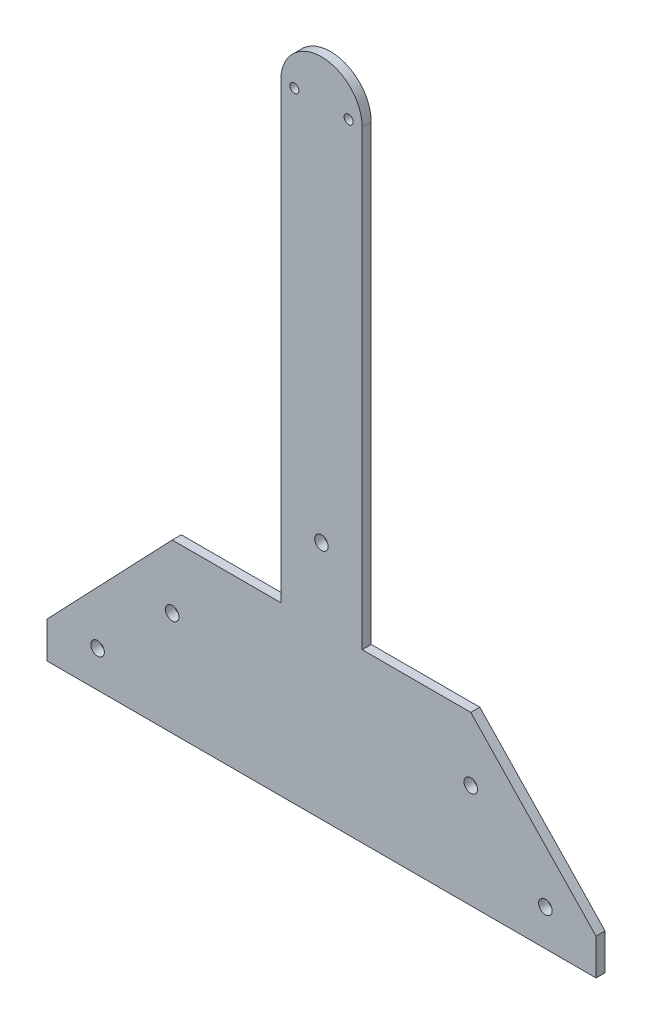
ISO-10303-21;
HEADER;
FILE_DESCRIPTION(('STEP AP214'),'2;1');
FILE_NAME('part.step','',(''),(''),'','','');
FILE_SCHEMA(('AUTOMOTIVE_DESIGN { 1 0 10303 214 1 1 1 1 }'));
ENDSEC;
DATA;
#1=APPLICATION_CONTEXT('core data for automotive mechanical design processes');
#2=APPLICATION_PROTOCOL_DEFINITION('international standard','automotive_design',2000,#1);
#3=PRODUCT_CONTEXT('',#1,'mechanical');
#4=PRODUCT('Part','Part','',(#3));
#5=PRODUCT_RELATED_PRODUCT_CATEGORY('part','',(#4));
#6=PRODUCT_DEFINITION_FORMATION('','',#4);
#7=PRODUCT_DEFINITION_CONTEXT('part definition',#1,'design');
#8=PRODUCT_DEFINITION('design','',#6,#7);
#9=PRODUCT_DEFINITION_SHAPE('','',#8);
#10=(LENGTH_UNIT() NAMED_UNIT(*) SI_UNIT(.MILLI.,.METRE.));
#11=(NAMED_UNIT(*) PLANE_ANGLE_UNIT() SI_UNIT($,.RADIAN.));
#12=(NAMED_UNIT(*) SI_UNIT($,.STERADIAN.) SOLID_ANGLE_UNIT());
#13=UNCERTAINTY_MEASURE_WITH_UNIT(LENGTH_MEASURE(1.E-05),#10,'distance_accuracy_value','');
#14=(GEOMETRIC_REPRESENTATION_CONTEXT(3) GLOBAL_UNCERTAINTY_ASSIGNED_CONTEXT((#13)) GLOBAL_UNIT_ASSIGNED_CONTEXT((#10,
#11,#12)) REPRESENTATION_CONTEXT('',''));
#15=CARTESIAN_POINT('',(0.,0.,0.));
#16=DIRECTION('',(0.,0.,1.));
#17=DIRECTION('',(1.,0.,0.));
#18=AXIS2_PLACEMENT_3D('',#15,#16,#17);
#19=CARTESIAN_POINT('',(-0.291428571428588,121.645714285714,2.));
#20=DIRECTION('',(0.,0.,-1.));
#21=DIRECTION('',(-1.,0.,0.));
#22=AXIS2_PLACEMENT_3D('',#19,#20,#21);
#23=CYLINDRICAL_SURFACE('',#22,9.);
#24=CARTESIAN_POINT('',(-0.291428571428588,121.645714285714,0.));
#25=DIRECTION('',(0.,0.,1.));
#26=DIRECTION('',(1.,0.,0.));
#27=AXIS2_PLACEMENT_3D('',#24,#25,#26);
#28=CIRCLE('',#27,9.);
#29=CARTESIAN_POINT('',(-9.29142857142859,121.645714285714,0.));
#30=VERTEX_POINT('',#29);
#31=CARTESIAN_POINT('',(8.70857142857141,121.645714285714,0.));
#32=VERTEX_POINT('',#31);
#33=EDGE_CURVE('E181',#30,#32,#28,.F.);
#34=ORIENTED_EDGE('',*,*,#33,.F.);
#35=DIRECTION('',(0.,0.,-1.));
#36=VECTOR('',#35,1.);
#37=CARTESIAN_POINT('',(-9.29142857142859,121.645714285714,2.));
#38=LINE('',#37,#36);
#39=CARTESIAN_POINT('',(-9.29142857142859,121.645714285714,2.));
#40=VERTEX_POINT('',#39);
#41=EDGE_CURVE('E11',#40,#30,#38,.T.);
#42=ORIENTED_EDGE('',*,*,#41,.F.);
#43=CARTESIAN_POINT('',(-0.291428571428588,121.645714285714,2.));
#44=DIRECTION('',(0.,0.,1.));
#45=DIRECTION('',(1.,0.,0.));
#46=AXIS2_PLACEMENT_3D('',#43,#44,#45);
#47=CIRCLE('',#46,9.);
#48=CARTESIAN_POINT('',(8.70857142857141,121.645714285714,2.));
#49=VERTEX_POINT('',#48);
#50=EDGE_CURVE('E343',#40,#49,#47,.F.);
#51=ORIENTED_EDGE('',*,*,#50,.T.);
#52=DIRECTION('',(0.,0.,-1.));
#53=VECTOR('',#52,1.);
#54=CARTESIAN_POINT('',(8.70857142857141,121.645714285714,2.));
#55=LINE('',#54,#53);
#56=EDGE_CURVE('E59',#49,#32,#55,.T.);
#57=ORIENTED_EDGE('',*,*,#56,.T.);
#58=EDGE_LOOP('',(#34,#42,#51,#57));
#59=FACE_BOUND('',#58,.T.);
#60=ADVANCED_FACE('F41',(#59),#23,.T.);
#61=CARTESIAN_POINT('',(-9.29142857142857,0.,2.));
#62=DIRECTION('',(1.,0.,0.));
#63=DIRECTION('',(0.,1.,0.));
#64=AXIS2_PLACEMENT_3D('',#61,#62,#63);
#65=PLANE('',#64);
#66=DIRECTION('',(0.,-1.,0.));
#67=VECTOR('',#66,1.);
#68=CARTESIAN_POINT('',(-9.29142857142857,0.,0.));
#69=LINE('',#68,#67);
#70=CARTESIAN_POINT('',(-9.29142857142857,21.6457142857143,0.));
#71=VERTEX_POINT('',#70);
#72=EDGE_CURVE('E184',#30,#71,#69,.T.);
#73=ORIENTED_EDGE('',*,*,#72,.T.);
#74=DIRECTION('',(0.,0.,-1.));
#75=VECTOR('',#74,1.);
#76=CARTESIAN_POINT('',(-9.29142857142857,21.6457142857143,2.));
#77=LINE('',#76,#75);
#78=CARTESIAN_POINT('',(-9.29142857142857,21.6457142857143,2.));
#79=VERTEX_POINT('',#78);
#80=EDGE_CURVE('E51',#79,#71,#77,.T.);
#81=ORIENTED_EDGE('',*,*,#80,.F.);
#82=DIRECTION('',(0.,-1.,0.));
#83=VECTOR('',#82,1.);
#84=CARTESIAN_POINT('',(-9.29142857142857,0.,2.));
#85=LINE('',#84,#83);
#86=EDGE_CURVE('E346',#40,#79,#85,.T.);
#87=ORIENTED_EDGE('',*,*,#86,.F.);
#88=ORIENTED_EDGE('',*,*,#41,.T.);
#89=EDGE_LOOP('',(#73,#81,#87,#88));
#90=FACE_BOUND('',#89,.T.);
#91=ADVANCED_FACE('F273',(#90),#65,.F.);
#92=CARTESIAN_POINT('',(0.,21.6457142857143,2.));
#93=DIRECTION('',(0.,-1.,0.));
#94=DIRECTION('',(0.,0.,-1.));
#95=AXIS2_PLACEMENT_3D('',#92,#93,#94);
#96=PLANE('',#95);
#97=DIRECTION('',(-1.,0.,0.));
#98=VECTOR('',#97,1.);
#99=CARTESIAN_POINT('',(0.,21.6457142857143,0.));
#100=LINE('',#99,#98);
#101=CARTESIAN_POINT('',(-33.2914285714285,21.6457142857143,0.));
#102=VERTEX_POINT('',#101);
#103=EDGE_CURVE('E188',#71,#102,#100,.T.);
#104=ORIENTED_EDGE('',*,*,#103,.T.);
#105=DIRECTION('',(0.,0.,-1.));
#106=VECTOR('',#105,1.);
#107=CARTESIAN_POINT('',(-33.2914285714285,21.6457142857143,2.));
#108=LINE('',#107,#106);
#109=CARTESIAN_POINT('',(-33.2914285714285,21.6457142857143,2.));
#110=VERTEX_POINT('',#109);
#111=EDGE_CURVE('E259',#110,#102,#108,.T.);
#112=ORIENTED_EDGE('',*,*,#111,.F.);
#113=DIRECTION('',(-1.,0.,0.));
#114=VECTOR('',#113,1.);
#115=CARTESIAN_POINT('',(0.,21.6457142857143,2.));
#116=LINE('',#115,#114);
#117=EDGE_CURVE('E269',#79,#110,#116,.T.);
#118=ORIENTED_EDGE('',*,*,#117,.F.);
#119=ORIENTED_EDGE('',*,*,#80,.T.);
#120=EDGE_LOOP('',(#104,#112,#118,#119));
#121=FACE_BOUND('',#120,.T.);
#122=ADVANCED_FACE('F266',(#121),#96,.F.);
#123=CARTESIAN_POINT('',(-28.222971342814,26.9529891897488,2.));
#124=DIRECTION('',(0.723190679855601,-0.690648420377542,0.));
#125=DIRECTION('',(0.690648420377542,0.723190679855601,0.));
#126=AXIS2_PLACEMENT_3D('',#123,#124,#125);
#127=PLANE('',#126);
#128=DIRECTION('',(-0.690648420377542,-0.723190679855601,0.));
#129=VECTOR('',#128,1.);
#130=CARTESIAN_POINT('',(-28.222971342814,26.9529891897488,0.));
#131=LINE('',#130,#129);
#132=CARTESIAN_POINT('',(-60.9864815482558,-7.35428571428549,0.));
#133=VERTEX_POINT('',#132);
#134=EDGE_CURVE('E192',#102,#133,#131,.T.);
#135=ORIENTED_EDGE('',*,*,#134,.T.);
#136=DIRECTION('',(0.,0.,-1.));
#137=VECTOR('',#136,1.);
#138=CARTESIAN_POINT('',(-60.9864815482558,-7.35428571428549,2.));
#139=LINE('',#138,#137);
#140=CARTESIAN_POINT('',(-60.9864815482558,-7.35428571428549,2.));
#141=VERTEX_POINT('',#140);
#142=EDGE_CURVE('E255',#141,#133,#139,.T.);
#143=ORIENTED_EDGE('',*,*,#142,.F.);
#144=DIRECTION('',(-0.690648420377542,-0.723190679855601,0.));
#145=VECTOR('',#144,1.);
#146=CARTESIAN_POINT('',(-28.222971342814,26.9529891897488,2.));
#147=LINE('',#146,#145);
#148=EDGE_CURVE('E353',#110,#141,#147,.T.);
#149=ORIENTED_EDGE('',*,*,#148,.F.);
#150=ORIENTED_EDGE('',*,*,#111,.T.);
#151=EDGE_LOOP('',(#135,#143,#149,#150));
#152=FACE_BOUND('',#151,.T.);
#153=ADVANCED_FACE('F285',(#152),#127,.F.);
#154=CARTESIAN_POINT('',(-60.9864815482558,0.,2.));
#155=DIRECTION('',(1.,0.,0.));
#156=DIRECTION('',(0.,0.,-1.));
#157=AXIS2_PLACEMENT_3D('',#154,#155,#156);
#158=PLANE('',#157);
#159=DIRECTION('',(0.,-1.,0.));
#160=VECTOR('',#159,1.);
#161=CARTESIAN_POINT('',(-60.9864815482558,0.,0.));
#162=LINE('',#161,#160);
#163=CARTESIAN_POINT('',(-60.9864815482558,-15.3542857142855,0.));
#164=VERTEX_POINT('',#163);
#165=EDGE_CURVE('E196',#133,#164,#162,.T.);
#166=ORIENTED_EDGE('',*,*,#165,.T.);
#167=DIRECTION('',(0.,0.,-1.));
#168=VECTOR('',#167,1.);
#169=CARTESIAN_POINT('',(-60.9864815482558,-15.3542857142855,2.));
#170=LINE('',#169,#168);
#171=CARTESIAN_POINT('',(-60.9864815482558,-15.3542857142855,2.));
#172=VERTEX_POINT('',#171);
#173=EDGE_CURVE('E251',#172,#164,#170,.T.);
#174=ORIENTED_EDGE('',*,*,#173,.F.);
#175=DIRECTION('',(0.,-1.,0.));
#176=VECTOR('',#175,1.);
#177=CARTESIAN_POINT('',(-60.9864815482558,0.,2.));
#178=LINE('',#177,#176);
#179=EDGE_CURVE('E357',#141,#172,#178,.T.);
#180=ORIENTED_EDGE('',*,*,#179,.F.);
#181=ORIENTED_EDGE('',*,*,#142,.T.);
#182=EDGE_LOOP('',(#166,#174,#180,#181));
#183=FACE_BOUND('',#182,.T.);
#184=ADVANCED_FACE('F288',(#183),#158,.F.);
#185=CARTESIAN_POINT('',(0.,-15.3542857142855,2.));
#186=DIRECTION('',(0.,1.,0.));
#187=DIRECTION('',(0.,0.,1.));
#188=AXIS2_PLACEMENT_3D('',#185,#186,#187);
#189=PLANE('',#188);
#190=DIRECTION('',(1.,0.,0.));
#191=VECTOR('',#190,1.);
#192=CARTESIAN_POINT('',(0.,-15.3542857142855,0.));
#193=LINE('',#192,#191);
#194=CARTESIAN_POINT('',(60.4036244053986,-15.3542857142855,0.));
#195=VERTEX_POINT('',#194);
#196=EDGE_CURVE('E200',#164,#195,#193,.T.);
#197=ORIENTED_EDGE('',*,*,#196,.T.);
#198=DIRECTION('',(0.,0.,-1.));
#199=VECTOR('',#198,1.);
#200=CARTESIAN_POINT('',(60.4036244053986,-15.3542857142855,2.));
#201=LINE('',#200,#199);
#202=CARTESIAN_POINT('',(60.4036244053986,-15.3542857142855,2.));
#203=VERTEX_POINT('',#202);
#204=EDGE_CURVE('E248',#203,#195,#201,.T.);
#205=ORIENTED_EDGE('',*,*,#204,.F.);
#206=DIRECTION('',(1.,0.,0.));
#207=VECTOR('',#206,1.);
#208=CARTESIAN_POINT('',(0.,-15.3542857142855,2.));
#209=LINE('',#208,#207);
#210=EDGE_CURVE('E361',#172,#203,#209,.T.);
#211=ORIENTED_EDGE('',*,*,#210,.F.);
#212=ORIENTED_EDGE('',*,*,#173,.T.);
#213=EDGE_LOOP('',(#197,#205,#211,#212));
#214=FACE_BOUND('',#213,.T.);
#215=ADVANCED_FACE('F292',(#214),#189,.F.);
#216=CARTESIAN_POINT('',(60.4036244053986,0.,2.));
#217=DIRECTION('',(1.,0.,0.));
#218=DIRECTION('',(0.,0.,-1.));
#219=AXIS2_PLACEMENT_3D('',#216,#217,#218);
#220=PLANE('',#219);
#221=DIRECTION('',(0.,-1.,0.));
#222=VECTOR('',#221,1.);
#223=CARTESIAN_POINT('',(60.4036244053986,0.,0.));
#224=LINE('',#223,#222);
#225=CARTESIAN_POINT('',(60.4036244053986,-7.35428571428548,0.));
#226=VERTEX_POINT('',#225);
#227=EDGE_CURVE('E204',#226,#195,#224,.T.);
#228=ORIENTED_EDGE('',*,*,#227,.F.);
#229=DIRECTION('',(0.,0.,-1.));
#230=VECTOR('',#229,1.);
#231=CARTESIAN_POINT('',(60.4036244053986,-7.35428571428548,2.));
#232=LINE('',#231,#230);
#233=CARTESIAN_POINT('',(60.4036244053986,-7.35428571428548,2.));
#234=VERTEX_POINT('',#233);
#235=EDGE_CURVE('E131',#234,#226,#232,.T.);
#236=ORIENTED_EDGE('',*,*,#235,.F.);
#237=DIRECTION('',(0.,-1.,0.));
#238=VECTOR('',#237,1.);
#239=CARTESIAN_POINT('',(60.4036244053986,0.,2.));
#240=LINE('',#239,#238);
#241=EDGE_CURVE('E142',#234,#203,#240,.T.);
#242=ORIENTED_EDGE('',*,*,#241,.T.);
#243=ORIENTED_EDGE('',*,*,#204,.T.);
#244=EDGE_LOOP('',(#228,#236,#242,#243));
#245=FACE_BOUND('',#244,.T.);
#246=ADVANCED_FACE('F296',(#245),#220,.T.);
#247=CARTESIAN_POINT('',(27.9181342830319,26.6618692407845,2.));
#248=DIRECTION('',(0.723190679855601,0.690648420377542,0.));
#249=DIRECTION('',(-0.690648420377542,0.723190679855601,0.));
#250=AXIS2_PLACEMENT_3D('',#247,#248,#249);
#251=PLANE('',#250);
#252=DIRECTION('',(0.690648420377542,-0.723190679855601,0.));
#253=VECTOR('',#252,1.);
#254=CARTESIAN_POINT('',(27.9181342830319,26.6618692407845,0.));
#255=LINE('',#254,#253);
#256=CARTESIAN_POINT('',(32.7085714285713,21.6457142857143,0.));
#257=VERTEX_POINT('',#256);
#258=EDGE_CURVE('E126',#257,#226,#255,.T.);
#259=ORIENTED_EDGE('',*,*,#258,.F.);
#260=DIRECTION('',(0.,0.,-1.));
#261=VECTOR('',#260,1.);
#262=CARTESIAN_POINT('',(32.7085714285713,21.6457142857143,2.));
#263=LINE('',#262,#261);
#264=CARTESIAN_POINT('',(32.7085714285713,21.6457142857143,2.));
#265=VERTEX_POINT('',#264);
#266=EDGE_CURVE('E121',#265,#257,#263,.T.);
#267=ORIENTED_EDGE('',*,*,#266,.F.);
#268=DIRECTION('',(0.690648420377542,-0.723190679855601,0.));
#269=VECTOR('',#268,1.);
#270=CARTESIAN_POINT('',(27.9181342830319,26.6618692407845,2.));
#271=LINE('',#270,#269);
#272=EDGE_CURVE('E124',#265,#234,#271,.T.);
#273=ORIENTED_EDGE('',*,*,#272,.T.);
#274=ORIENTED_EDGE('',*,*,#235,.T.);
#275=EDGE_LOOP('',(#259,#267,#273,#274));
#276=FACE_BOUND('',#275,.T.);
#277=ADVANCED_FACE('F123',(#276),#251,.T.);
#278=CARTESIAN_POINT('',(0.,21.6457142857143,2.));
#279=DIRECTION('',(0.,1.,0.));
#280=DIRECTION('',(0.,0.,1.));
#281=AXIS2_PLACEMENT_3D('',#278,#279,#280);
#282=PLANE('',#281);
#283=DIRECTION('',(1.,0.,0.));
#284=VECTOR('',#283,1.);
#285=CARTESIAN_POINT('',(0.,21.6457142857143,0.));
#286=LINE('',#285,#284);
#287=CARTESIAN_POINT('',(8.7085714285714,21.6457142857143,0.));
#288=VERTEX_POINT('',#287);
#289=EDGE_CURVE('E210',#288,#257,#286,.T.);
#290=ORIENTED_EDGE('',*,*,#289,.F.);
#291=DIRECTION('',(0.,0.,-1.));
#292=VECTOR('',#291,1.);
#293=CARTESIAN_POINT('',(8.7085714285714,21.6457142857143,2.));
#294=LINE('',#293,#292);
#295=CARTESIAN_POINT('',(8.7085714285714,21.6457142857143,2.));
#296=VERTEX_POINT('',#295);
#297=EDGE_CURVE('E90',#296,#288,#294,.T.);
#298=ORIENTED_EDGE('',*,*,#297,.F.);
#299=DIRECTION('',(1.,0.,0.));
#300=VECTOR('',#299,1.);
#301=CARTESIAN_POINT('',(0.,21.6457142857143,2.));
#302=LINE('',#301,#300);
#303=EDGE_CURVE('E140',#296,#265,#302,.T.);
#304=ORIENTED_EDGE('',*,*,#303,.T.);
#305=ORIENTED_EDGE('',*,*,#266,.T.);
#306=EDGE_LOOP('',(#290,#298,#304,#305));
#307=FACE_BOUND('',#306,.T.);
#308=ADVANCED_FACE('F145',(#307),#282,.T.);
#309=CARTESIAN_POINT('',(5.70857142857141,121.645714285714,2.));
#310=DIRECTION('',(0.,0.,-1.));
#311=DIRECTION('',(-1.,0.,0.));
#312=AXIS2_PLACEMENT_3D('',#309,#310,#311);
#313=CYLINDRICAL_SURFACE('',#312,1.);
#314=CARTESIAN_POINT('',(5.70857142857141,121.645714285714,2.));
#315=DIRECTION('',(0.,0.,1.));
#316=DIRECTION('',(1.,0.,0.));
#317=AXIS2_PLACEMENT_3D('',#314,#315,#316);
#318=CIRCLE('',#317,1.);
#319=CARTESIAN_POINT('',(6.70857142857141,121.645714285714,2.));
#320=VERTEX_POINT('',#319);
#321=EDGE_CURVE('E169',#320,#320,#318,.T.);
#322=ORIENTED_EDGE('',*,*,#321,.T.);
#323=EDGE_LOOP('',(#322));
#324=FACE_BOUND('',#323,.T.);
#325=CARTESIAN_POINT('',(5.70857142857141,121.645714285714,0.));
#326=DIRECTION('',(0.,0.,1.));
#327=DIRECTION('',(1.,0.,0.));
#328=AXIS2_PLACEMENT_3D('',#325,#326,#327);
#329=CIRCLE('',#328,1.);
#330=CARTESIAN_POINT('',(6.70857142857141,121.645714285714,0.));
#331=VERTEX_POINT('',#330);
#332=EDGE_CURVE('E233',#331,#331,#329,.T.);
#333=ORIENTED_EDGE('',*,*,#332,.F.);
#334=EDGE_LOOP('',(#333));
#335=FACE_BOUND('',#334,.T.);
#336=ADVANCED_FACE('F305',(#324,#335),#313,.F.);
#337=CARTESIAN_POINT('',(-49.7914285714285,-7.35428571428548,2.));
#338=DIRECTION('',(0.,0.,-1.));
#339=DIRECTION('',(-1.,0.,0.));
#340=AXIS2_PLACEMENT_3D('',#337,#338,#339);
#341=CYLINDRICAL_SURFACE('',#340,1.5);
#342=CARTESIAN_POINT('',(-49.7914285714285,-7.35428571428548,2.));
#343=DIRECTION('',(0.,0.,1.));
#344=DIRECTION('',(1.,0.,0.));
#345=AXIS2_PLACEMENT_3D('',#342,#343,#344);
#346=CIRCLE('',#345,1.5);
#347=CARTESIAN_POINT('',(-48.2914285714285,-7.35428571428548,2.));
#348=VERTEX_POINT('',#347);
#349=EDGE_CURVE('E165',#348,#348,#346,.F.);
#350=ORIENTED_EDGE('',*,*,#349,.F.);
#351=EDGE_LOOP('',(#350));
#352=FACE_BOUND('',#351,.T.);
#353=CARTESIAN_POINT('',(-49.7914285714285,-7.35428571428548,0.));
#354=DIRECTION('',(0.,0.,1.));
#355=DIRECTION('',(1.,0.,0.));
#356=AXIS2_PLACEMENT_3D('',#353,#354,#355);
#357=CIRCLE('',#356,1.5);
#358=CARTESIAN_POINT('',(-48.2914285714285,-7.35428571428548,0.));
#359=VERTEX_POINT('',#358);
#360=EDGE_CURVE('E229',#359,#359,#357,.F.);
#361=ORIENTED_EDGE('',*,*,#360,.T.);
#362=EDGE_LOOP('',(#361));
#363=FACE_BOUND('',#362,.T.);
#364=ADVANCED_FACE('F320',(#352,#363),#341,.F.);
#365=CARTESIAN_POINT('',(49.2085714285714,-7.3542857142857,2.));
#366=DIRECTION('',(0.,0.,-1.));
#367=DIRECTION('',(-1.,0.,0.));
#368=AXIS2_PLACEMENT_3D('',#365,#366,#367);
#369=CYLINDRICAL_SURFACE('',#368,1.5);
#370=CARTESIAN_POINT('',(49.2085714285714,-7.3542857142857,2.));
#371=DIRECTION('',(0.,0.,1.));
#372=DIRECTION('',(1.,0.,0.));
#373=AXIS2_PLACEMENT_3D('',#370,#371,#372);
#374=CIRCLE('',#373,1.5);
#375=CARTESIAN_POINT('',(50.7085714285714,-7.3542857142857,2.));
#376=VERTEX_POINT('',#375);
#377=EDGE_CURVE('E161',#376,#376,#374,.T.);
#378=ORIENTED_EDGE('',*,*,#377,.T.);
#379=EDGE_LOOP('',(#378));
#380=FACE_BOUND('',#379,.T.);
#381=CARTESIAN_POINT('',(49.2085714285714,-7.3542857142857,0.));
#382=DIRECTION('',(0.,0.,1.));
#383=DIRECTION('',(1.,0.,0.));
#384=AXIS2_PLACEMENT_3D('',#381,#382,#383);
#385=CIRCLE('',#384,1.5);
#386=CARTESIAN_POINT('',(50.7085714285714,-7.3542857142857,0.));
#387=VERTEX_POINT('',#386);
#388=EDGE_CURVE('E225',#387,#387,#385,.T.);
#389=ORIENTED_EDGE('',*,*,#388,.F.);
#390=EDGE_LOOP('',(#389));
#391=FACE_BOUND('',#390,.T.);
#392=ADVANCED_FACE('F316',(#380,#391),#369,.F.);
#393=CARTESIAN_POINT('',(-33.2914285714285,7.64571428571553,2.));
#394=DIRECTION('',(0.,0.,-1.));
#395=DIRECTION('',(-1.,0.,0.));
#396=AXIS2_PLACEMENT_3D('',#393,#394,#395);
#397=CYLINDRICAL_SURFACE('',#396,1.5);
#398=CARTESIAN_POINT('',(-33.2914285714285,7.64571428571553,2.));
#399=DIRECTION('',(0.,0.,1.));
#400=DIRECTION('',(1.,0.,0.));
#401=AXIS2_PLACEMENT_3D('',#398,#399,#400);
#402=CIRCLE('',#401,1.5);
#403=CARTESIAN_POINT('',(-31.7914285714285,7.64571428571553,2.));
#404=VERTEX_POINT('',#403);
#405=EDGE_CURVE('E157',#404,#404,#402,.T.);
#406=ORIENTED_EDGE('',*,*,#405,.T.);
#407=EDGE_LOOP('',(#406));
#408=FACE_BOUND('',#407,.T.);
#409=CARTESIAN_POINT('',(-33.2914285714285,7.64571428571553,0.));
#410=DIRECTION('',(0.,0.,1.));
#411=DIRECTION('',(1.,0.,0.));
#412=AXIS2_PLACEMENT_3D('',#409,#410,#411);
#413=CIRCLE('',#412,1.5);
#414=CARTESIAN_POINT('',(-31.7914285714285,7.64571428571553,0.));
#415=VERTEX_POINT('',#414);
#416=EDGE_CURVE('E221',#415,#415,#413,.T.);
#417=ORIENTED_EDGE('',*,*,#416,.F.);
#418=EDGE_LOOP('',(#417));
#419=FACE_BOUND('',#418,.T.);
#420=ADVANCED_FACE('F312',(#408,#419),#397,.F.);
#421=CARTESIAN_POINT('',(32.7085714285715,7.64571428571414,2.));
#422=DIRECTION('',(0.,0.,-1.));
#423=DIRECTION('',(-1.,0.,0.));
#424=AXIS2_PLACEMENT_3D('',#421,#422,#423);
#425=CYLINDRICAL_SURFACE('',#424,1.5);
#426=CARTESIAN_POINT('',(32.7085714285715,7.64571428571414,2.));
#427=DIRECTION('',(0.,0.,1.));
#428=DIRECTION('',(1.,0.,0.));
#429=AXIS2_PLACEMENT_3D('',#426,#427,#428);
#430=CIRCLE('',#429,1.5);
#431=CARTESIAN_POINT('',(34.2085714285715,7.64571428571414,2.));
#432=VERTEX_POINT('',#431);
#433=EDGE_CURVE('E150',#432,#432,#430,.F.);
#434=ORIENTED_EDGE('',*,*,#433,.F.);
#435=EDGE_LOOP('',(#434));
#436=FACE_BOUND('',#435,.T.);
#437=CARTESIAN_POINT('',(32.7085714285715,7.64571428571414,0.));
#438=DIRECTION('',(0.,0.,1.));
#439=DIRECTION('',(1.,0.,0.));
#440=AXIS2_PLACEMENT_3D('',#437,#438,#439);
#441=CIRCLE('',#440,1.5);
#442=CARTESIAN_POINT('',(34.2085714285715,7.64571428571414,0.));
#443=VERTEX_POINT('',#442);
#444=EDGE_CURVE('E217',#443,#443,#441,.F.);
#445=ORIENTED_EDGE('',*,*,#444,.T.);
#446=EDGE_LOOP('',(#445));
#447=FACE_BOUND('',#446,.T.);
#448=ADVANCED_FACE('F309',(#436,#447),#425,.F.);
#449=CARTESIAN_POINT('',(8.70857142857139,0.,2.));
#450=DIRECTION('',(1.,0.,0.));
#451=DIRECTION('',(0.,1.,0.));
#452=AXIS2_PLACEMENT_3D('',#449,#450,#451);
#453=PLANE('',#452);
#454=DIRECTION('',(0.,-1.,0.));
#455=VECTOR('',#454,1.);
#456=CARTESIAN_POINT('',(8.70857142857139,0.,0.));
#457=LINE('',#456,#455);
#458=EDGE_CURVE('E213',#32,#288,#457,.T.);
#459=ORIENTED_EDGE('',*,*,#458,.F.);
#460=ORIENTED_EDGE('',*,*,#56,.F.);
#461=DIRECTION('',(0.,-1.,0.));
#462=VECTOR('',#461,1.);
#463=CARTESIAN_POINT('',(8.70857142857139,0.,2.));
#464=LINE('',#463,#462);
#465=EDGE_CURVE('E147',#49,#296,#464,.T.);
#466=ORIENTED_EDGE('',*,*,#465,.T.);
#467=ORIENTED_EDGE('',*,*,#297,.T.);
#468=EDGE_LOOP('',(#459,#460,#466,#467));
#469=FACE_BOUND('',#468,.T.);
#470=ADVANCED_FACE('F306',(#469),#453,.T.);
#471=CARTESIAN_POINT('',(-0.291428571428588,37.6457142857143,2.));
#472=DIRECTION('',(0.,0.,-1.));
#473=DIRECTION('',(-1.,0.,0.));
#474=AXIS2_PLACEMENT_3D('',#471,#472,#473);
#475=CYLINDRICAL_SURFACE('',#474,1.5);
#476=CARTESIAN_POINT('',(-0.291428571428588,37.6457142857143,2.));
#477=DIRECTION('',(0.,0.,1.));
#478=DIRECTION('',(1.,0.,0.));
#479=AXIS2_PLACEMENT_3D('',#476,#477,#478);
#480=CIRCLE('',#479,1.5);
#481=CARTESIAN_POINT('',(1.20857142857141,37.6457142857143,2.));
#482=VERTEX_POINT('',#481);
#483=EDGE_CURVE('E241',#482,#482,#480,.T.);
#484=ORIENTED_EDGE('',*,*,#483,.T.);
#485=EDGE_LOOP('',(#484));
#486=FACE_BOUND('',#485,.T.);
#487=CARTESIAN_POINT('',(-0.291428571428588,37.6457142857143,0.));
#488=DIRECTION('',(0.,0.,1.));
#489=DIRECTION('',(1.,0.,0.));
#490=AXIS2_PLACEMENT_3D('',#487,#488,#489);
#491=CIRCLE('',#490,1.5);
#492=CARTESIAN_POINT('',(1.20857142857141,37.6457142857143,0.));
#493=VERTEX_POINT('',#492);
#494=EDGE_CURVE('E177',#493,#493,#491,.T.);
#495=ORIENTED_EDGE('',*,*,#494,.F.);
#496=EDGE_LOOP('',(#495));
#497=FACE_BOUND('',#496,.T.);
#498=ADVANCED_FACE('F43',(#486,#497),#475,.F.);
#499=CARTESIAN_POINT('',(-6.29142857142859,121.645714285714,2.));
#500=DIRECTION('',(0.,0.,-1.));
#501=DIRECTION('',(-1.,0.,0.));
#502=AXIS2_PLACEMENT_3D('',#499,#500,#501);
#503=CYLINDRICAL_SURFACE('',#502,1.);
#504=CARTESIAN_POINT('',(-6.29142857142859,121.645714285714,2.));
#505=DIRECTION('',(0.,0.,1.));
#506=DIRECTION('',(1.,0.,0.));
#507=AXIS2_PLACEMENT_3D('',#504,#505,#506);
#508=CIRCLE('',#507,1.);
#509=CARTESIAN_POINT('',(-5.29142857142859,121.645714285714,2.));
#510=VERTEX_POINT('',#509);
#511=EDGE_CURVE('E173',#510,#510,#508,.F.);
#512=ORIENTED_EDGE('',*,*,#511,.F.);
#513=EDGE_LOOP('',(#512));
#514=FACE_BOUND('',#513,.T.);
#515=CARTESIAN_POINT('',(-6.29142857142859,121.645714285714,0.));
#516=DIRECTION('',(0.,0.,1.));
#517=DIRECTION('',(1.,0.,0.));
#518=AXIS2_PLACEMENT_3D('',#515,#516,#517);
#519=CIRCLE('',#518,1.);
#520=CARTESIAN_POINT('',(-5.29142857142859,121.645714285714,0.));
#521=VERTEX_POINT('',#520);
#522=EDGE_CURVE('E237',#521,#521,#519,.F.);
#523=ORIENTED_EDGE('',*,*,#522,.T.);
#524=EDGE_LOOP('',(#523));
#525=FACE_BOUND('',#524,.T.);
#526=ADVANCED_FACE('F328',(#514,#525),#503,.F.);
#527=CARTESIAN_POINT('',(0.,0.,2.));
#528=DIRECTION('',(0.,0.,1.));
#529=DIRECTION('',(1.,0.,0.));
#530=AXIS2_PLACEMENT_3D('',#527,#528,#529);
#531=PLANE('',#530);
#532=ORIENTED_EDGE('',*,*,#483,.F.);
#533=EDGE_LOOP('',(#532));
#534=FACE_BOUND('',#533,.T.);
#535=ORIENTED_EDGE('',*,*,#50,.F.);
#536=ORIENTED_EDGE('',*,*,#86,.T.);
#537=ORIENTED_EDGE('',*,*,#117,.T.);
#538=ORIENTED_EDGE('',*,*,#148,.T.);
#539=ORIENTED_EDGE('',*,*,#179,.T.);
#540=ORIENTED_EDGE('',*,*,#210,.T.);
#541=ORIENTED_EDGE('',*,*,#241,.F.);
#542=ORIENTED_EDGE('',*,*,#272,.F.);
#543=ORIENTED_EDGE('',*,*,#303,.F.);
#544=ORIENTED_EDGE('',*,*,#465,.F.);
#545=EDGE_LOOP('',(#535,#536,#537,#538,#539,#540,#541,#542,#543,#544));
#546=FACE_BOUND('',#545,.T.);
#547=ORIENTED_EDGE('',*,*,#433,.T.);
#548=EDGE_LOOP('',(#547));
#549=FACE_BOUND('',#548,.T.);
#550=ORIENTED_EDGE('',*,*,#405,.F.);
#551=EDGE_LOOP('',(#550));
#552=FACE_BOUND('',#551,.T.);
#553=ORIENTED_EDGE('',*,*,#377,.F.);
#554=EDGE_LOOP('',(#553));
#555=FACE_BOUND('',#554,.T.);
#556=ORIENTED_EDGE('',*,*,#349,.T.);
#557=EDGE_LOOP('',(#556));
#558=FACE_BOUND('',#557,.T.);
#559=ORIENTED_EDGE('',*,*,#321,.F.);
#560=EDGE_LOOP('',(#559));
#561=FACE_BOUND('',#560,.T.);
#562=ORIENTED_EDGE('',*,*,#511,.T.);
#563=EDGE_LOOP('',(#562));
#564=FACE_BOUND('',#563,.T.);
#565=ADVANCED_FACE('F137',(#534,#546,#549,#552,#555,#558,#561,#564),#531,.T.);
#566=CARTESIAN_POINT('',(0.,0.,0.));
#567=DIRECTION('',(0.,0.,1.));
#568=DIRECTION('',(1.,0.,0.));
#569=AXIS2_PLACEMENT_3D('',#566,#567,#568);
#570=PLANE('',#569);
#571=ORIENTED_EDGE('',*,*,#494,.T.);
#572=EDGE_LOOP('',(#571));
#573=FACE_BOUND('',#572,.T.);
#574=ORIENTED_EDGE('',*,*,#33,.T.);
#575=ORIENTED_EDGE('',*,*,#458,.T.);
#576=ORIENTED_EDGE('',*,*,#289,.T.);
#577=ORIENTED_EDGE('',*,*,#258,.T.);
#578=ORIENTED_EDGE('',*,*,#227,.T.);
#579=ORIENTED_EDGE('',*,*,#196,.F.);
#580=ORIENTED_EDGE('',*,*,#165,.F.);
#581=ORIENTED_EDGE('',*,*,#134,.F.);
#582=ORIENTED_EDGE('',*,*,#103,.F.);
#583=ORIENTED_EDGE('',*,*,#72,.F.);
#584=EDGE_LOOP('',(#574,#575,#576,#577,#578,#579,#580,#581,#582,#583));
#585=FACE_BOUND('',#584,.T.);
#586=ORIENTED_EDGE('',*,*,#444,.F.);
#587=EDGE_LOOP('',(#586));
#588=FACE_BOUND('',#587,.T.);
#589=ORIENTED_EDGE('',*,*,#416,.T.);
#590=EDGE_LOOP('',(#589));
#591=FACE_BOUND('',#590,.T.);
#592=ORIENTED_EDGE('',*,*,#388,.T.);
#593=EDGE_LOOP('',(#592));
#594=FACE_BOUND('',#593,.T.);
#595=ORIENTED_EDGE('',*,*,#360,.F.);
#596=EDGE_LOOP('',(#595));
#597=FACE_BOUND('',#596,.T.);
#598=ORIENTED_EDGE('',*,*,#332,.T.);
#599=EDGE_LOOP('',(#598));
#600=FACE_BOUND('',#599,.T.);
#601=ORIENTED_EDGE('',*,*,#522,.F.);
#602=EDGE_LOOP('',(#601));
#603=FACE_BOUND('',#602,.T.);
#604=ADVANCED_FACE('F275',(#573,#585,#588,#591,#594,#597,#600,#603),#570,.F.);
#605=CLOSED_SHELL('',(#60,#91,#122,#153,#184,#215,#246,#277,#308,#336,#364,#392,#420,#448,#470,
#498,#526,#565,#604));
#606=MANIFOLD_SOLID_BREP('B2',#605);
#607=ADVANCED_BREP_SHAPE_REPRESENTATION('',(#18,#606),#14);
#608=SHAPE_DEFINITION_REPRESENTATION(#9,#607);
ENDSEC;
END-ISO-10303-21;
